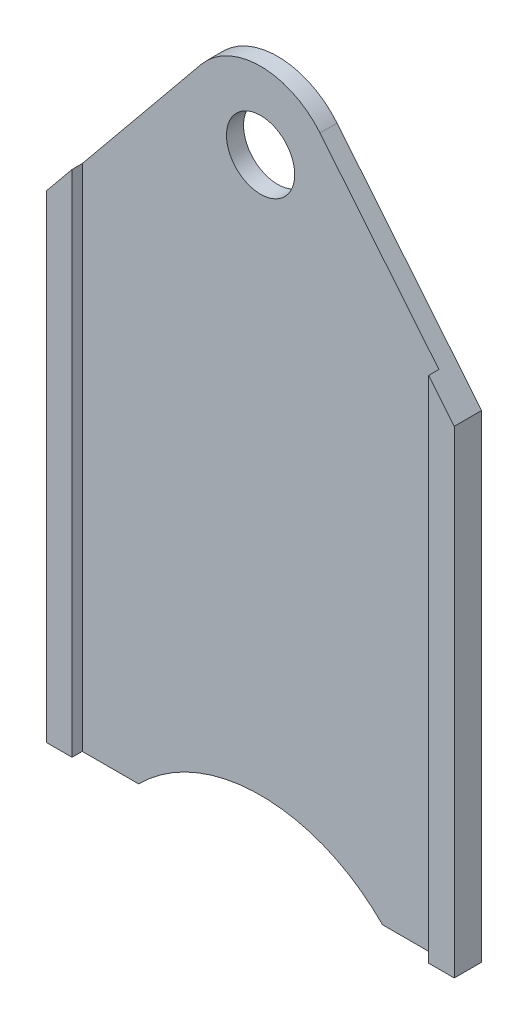
ISO-10303-21;
HEADER;
FILE_DESCRIPTION(('STEP AP214'),'2;1');
FILE_NAME('part.step','',(''),(''),'','','');
FILE_SCHEMA(('AUTOMOTIVE_DESIGN { 1 0 10303 214 1 1 1 1 }'));
ENDSEC;
DATA;
#1=APPLICATION_CONTEXT('core data for automotive mechanical design processes');
#2=APPLICATION_PROTOCOL_DEFINITION('international standard','automotive_design',2000,#1);
#3=PRODUCT_CONTEXT('',#1,'mechanical');
#4=PRODUCT('Part','Part','',(#3));
#5=PRODUCT_RELATED_PRODUCT_CATEGORY('part','',(#4));
#6=PRODUCT_DEFINITION_FORMATION('','',#4);
#7=PRODUCT_DEFINITION_CONTEXT('part definition',#1,'design');
#8=PRODUCT_DEFINITION('design','',#6,#7);
#9=PRODUCT_DEFINITION_SHAPE('','',#8);
#10=(LENGTH_UNIT() NAMED_UNIT(*) SI_UNIT(.MILLI.,.METRE.));
#11=(NAMED_UNIT(*) PLANE_ANGLE_UNIT() SI_UNIT($,.RADIAN.));
#12=(NAMED_UNIT(*) SI_UNIT($,.STERADIAN.) SOLID_ANGLE_UNIT());
#13=UNCERTAINTY_MEASURE_WITH_UNIT(LENGTH_MEASURE(1.E-05),#10,'distance_accuracy_value','');
#14=(GEOMETRIC_REPRESENTATION_CONTEXT(3) GLOBAL_UNCERTAINTY_ASSIGNED_CONTEXT((#13)) GLOBAL_UNIT_ASSIGNED_CONTEXT((#10,
#11,#12)) REPRESENTATION_CONTEXT('',''));
#15=CARTESIAN_POINT('',(0.,0.,0.));
#16=DIRECTION('',(0.,0.,1.));
#17=DIRECTION('',(1.,0.,0.));
#18=AXIS2_PLACEMENT_3D('',#15,#16,#17);
#19=CARTESIAN_POINT('',(0.,85.,2.));
#20=DIRECTION('',(0.,0.,1.));
#21=DIRECTION('',(1.,0.,0.));
#22=AXIS2_PLACEMENT_3D('',#19,#20,#21);
#23=PLANE('',#22);
#24=CARTESIAN_POINT('',(0.,85.,2.));
#25=DIRECTION('',(0.,0.,1.));
#26=DIRECTION('',(1.,0.,0.));
#27=AXIS2_PLACEMENT_3D('',#24,#25,#26);
#28=CIRCLE('',#27,4.00000000000001);
#29=CARTESIAN_POINT('',(4.00000000000001,85.,2.));
#30=VERTEX_POINT('',#29);
#31=EDGE_CURVE('E169',#30,#30,#28,.T.);
#32=ORIENTED_EDGE('',*,*,#31,.F.);
#33=EDGE_LOOP('',(#32));
#34=FACE_BOUND('',#33,.T.);
#35=DIRECTION('',(1.,0.,0.));
#36=VECTOR('',#35,1.);
#37=CARTESIAN_POINT('',(14.2828568570857,14.,2.));
#38=LINE('',#37,#36);
#39=CARTESIAN_POINT('',(14.2828568570857,14.,2.));
#40=VERTEX_POINT('',#39);
#41=CARTESIAN_POINT('',(20.9,14.,2.));
#42=VERTEX_POINT('',#41);
#43=EDGE_CURVE('E48',#40,#42,#38,.T.);
#44=ORIENTED_EDGE('',*,*,#43,.T.);
#45=DIRECTION('',(0.,-1.,0.));
#46=VECTOR('',#45,1.);
#47=CARTESIAN_POINT('',(20.9,14.,2.));
#48=LINE('',#47,#46);
#49=CARTESIAN_POINT('',(20.9,73.666942903836,2.));
#50=VERTEX_POINT('',#49);
#51=EDGE_CURVE('E142',#50,#42,#48,.T.);
#52=ORIENTED_EDGE('',*,*,#51,.F.);
#53=DIRECTION('',(-0.633209214452428,0.773980678526628,0.));
#54=VECTOR('',#53,1.);
#55=CARTESIAN_POINT('',(6.96582610673965,90.6988829300718,2.));
#56=LINE('',#55,#54);
#57=CARTESIAN_POINT('',(6.96582610673965,90.6988829300718,2.));
#58=VERTEX_POINT('',#57);
#59=EDGE_CURVE('E146',#50,#58,#56,.T.);
#60=ORIENTED_EDGE('',*,*,#59,.T.);
#61=CARTESIAN_POINT('',(0.,85.,2.));
#62=DIRECTION('',(0.,0.,1.));
#63=DIRECTION('',(1.,0.,0.));
#64=AXIS2_PLACEMENT_3D('',#61,#62,#63);
#65=CIRCLE('',#64,8.99999999999999);
#66=CARTESIAN_POINT('',(-6.96582610673965,90.6988829300718,2.));
#67=VERTEX_POINT('',#66);
#68=EDGE_CURVE('E182',#58,#67,#65,.T.);
#69=ORIENTED_EDGE('',*,*,#68,.T.);
#70=DIRECTION('',(-0.633209214452428,-0.773980678526628,0.));
#71=VECTOR('',#70,1.);
#72=CARTESIAN_POINT('',(-6.96582610673965,90.6988829300718,2.));
#73=LINE('',#72,#71);
#74=CARTESIAN_POINT('',(-20.9,73.666942903836,2.));
#75=VERTEX_POINT('',#74);
#76=EDGE_CURVE('E184',#67,#75,#73,.T.);
#77=ORIENTED_EDGE('',*,*,#76,.T.);
#78=DIRECTION('',(0.,1.,0.));
#79=VECTOR('',#78,1.);
#80=CARTESIAN_POINT('',(-20.9,14.,2.));
#81=LINE('',#80,#79);
#82=CARTESIAN_POINT('',(-20.9,14.,2.));
#83=VERTEX_POINT('',#82);
#84=EDGE_CURVE('E55',#83,#75,#81,.T.);
#85=ORIENTED_EDGE('',*,*,#84,.F.);
#86=DIRECTION('',(1.,0.,0.));
#87=VECTOR('',#86,1.);
#88=CARTESIAN_POINT('',(-23.9,14.,2.));
#89=LINE('',#88,#87);
#90=CARTESIAN_POINT('',(-14.2828568570857,14.,2.));
#91=VERTEX_POINT('',#90);
#92=EDGE_CURVE('E175',#83,#91,#89,.T.);
#93=ORIENTED_EDGE('',*,*,#92,.T.);
#94=CARTESIAN_POINT('',(0.,0.,2.));
#95=DIRECTION('',(0.,0.,-1.));
#96=DIRECTION('',(1.,0.,0.));
#97=AXIS2_PLACEMENT_3D('',#94,#95,#96);
#98=CIRCLE('',#97,20.);
#99=EDGE_CURVE('E177',#91,#40,#98,.T.);
#100=ORIENTED_EDGE('',*,*,#99,.T.);
#101=EDGE_LOOP('',(#44,#52,#60,#69,#77,#85,#93,#100));
#102=FACE_BOUND('',#101,.T.);
#103=ADVANCED_FACE('F33',(#34,#102),#23,.T.);
#104=CARTESIAN_POINT('',(0.,85.,0.));
#105=DIRECTION('',(0.,0.,1.));
#106=DIRECTION('',(1.,0.,0.));
#107=AXIS2_PLACEMENT_3D('',#104,#105,#106);
#108=PLANE('',#107);
#109=DIRECTION('',(0.,-1.,0.));
#110=VECTOR('',#109,1.);
#111=CARTESIAN_POINT('',(-23.9,14.,0.));
#112=LINE('',#111,#110);
#113=CARTESIAN_POINT('',(-23.9,70.,0.));
#114=VERTEX_POINT('',#113);
#115=CARTESIAN_POINT('',(-23.9,14.,0.));
#116=VERTEX_POINT('',#115);
#117=EDGE_CURVE('E172',#114,#116,#112,.T.);
#118=ORIENTED_EDGE('',*,*,#117,.F.);
#119=DIRECTION('',(-0.633209214452428,-0.773980678526628,0.));
#120=VECTOR('',#119,1.);
#121=CARTESIAN_POINT('',(-6.96582610673965,90.6988829300718,0.));
#122=LINE('',#121,#120);
#123=CARTESIAN_POINT('',(-6.96582610673965,90.6988829300718,0.));
#124=VERTEX_POINT('',#123);
#125=EDGE_CURVE('E178',#124,#114,#122,.T.);
#126=ORIENTED_EDGE('',*,*,#125,.F.);
#127=CARTESIAN_POINT('',(0.,85.,0.));
#128=DIRECTION('',(0.,0.,1.));
#129=DIRECTION('',(1.,0.,0.));
#130=AXIS2_PLACEMENT_3D('',#127,#128,#129);
#131=CIRCLE('',#130,8.99999999999999);
#132=CARTESIAN_POINT('',(6.96582610673965,90.6988829300718,0.));
#133=VERTEX_POINT('',#132);
#134=EDGE_CURVE('E199',#133,#124,#131,.T.);
#135=ORIENTED_EDGE('',*,*,#134,.F.);
#136=DIRECTION('',(-0.633209214452428,0.773980678526628,0.));
#137=VECTOR('',#136,1.);
#138=CARTESIAN_POINT('',(6.96582610673965,90.6988829300718,0.));
#139=LINE('',#138,#137);
#140=CARTESIAN_POINT('',(23.9,70.,0.));
#141=VERTEX_POINT('',#140);
#142=EDGE_CURVE('E197',#141,#133,#139,.T.);
#143=ORIENTED_EDGE('',*,*,#142,.F.);
#144=DIRECTION('',(0.,1.,0.));
#145=VECTOR('',#144,1.);
#146=CARTESIAN_POINT('',(23.9,14.,0.));
#147=LINE('',#146,#145);
#148=CARTESIAN_POINT('',(23.9,14.,0.));
#149=VERTEX_POINT('',#148);
#150=EDGE_CURVE('E195',#149,#141,#147,.T.);
#151=ORIENTED_EDGE('',*,*,#150,.F.);
#152=DIRECTION('',(1.,0.,0.));
#153=VECTOR('',#152,1.);
#154=CARTESIAN_POINT('',(14.2828568570857,14.,0.));
#155=LINE('',#154,#153);
#156=CARTESIAN_POINT('',(14.2828568570857,14.,0.));
#157=VERTEX_POINT('',#156);
#158=EDGE_CURVE('E193',#157,#149,#155,.T.);
#159=ORIENTED_EDGE('',*,*,#158,.F.);
#160=CARTESIAN_POINT('',(0.,0.,0.));
#161=DIRECTION('',(0.,0.,-1.));
#162=DIRECTION('',(1.,0.,0.));
#163=AXIS2_PLACEMENT_3D('',#160,#161,#162);
#164=CIRCLE('',#163,20.);
#165=CARTESIAN_POINT('',(-14.2828568570857,14.,0.));
#166=VERTEX_POINT('',#165);
#167=EDGE_CURVE('E191',#166,#157,#164,.T.);
#168=ORIENTED_EDGE('',*,*,#167,.F.);
#169=DIRECTION('',(1.,0.,0.));
#170=VECTOR('',#169,1.);
#171=CARTESIAN_POINT('',(-23.9,14.,0.));
#172=LINE('',#171,#170);
#173=EDGE_CURVE('E189',#116,#166,#172,.T.);
#174=ORIENTED_EDGE('',*,*,#173,.F.);
#175=EDGE_LOOP('',(#118,#126,#135,#143,#151,#159,#168,#174));
#176=FACE_BOUND('',#175,.T.);
#177=CARTESIAN_POINT('',(0.,85.,0.));
#178=DIRECTION('',(0.,0.,1.));
#179=DIRECTION('',(1.,0.,0.));
#180=AXIS2_PLACEMENT_3D('',#177,#178,#179);
#181=CIRCLE('',#180,4.00000000000001);
#182=CARTESIAN_POINT('',(4.00000000000001,85.,0.));
#183=VERTEX_POINT('',#182);
#184=EDGE_CURVE('E168',#183,#183,#181,.T.);
#185=ORIENTED_EDGE('',*,*,#184,.T.);
#186=EDGE_LOOP('',(#185));
#187=FACE_BOUND('',#186,.T.);
#188=ADVANCED_FACE('F228',(#176,#187),#108,.F.);
#189=CARTESIAN_POINT('',(-23.9,14.,2.));
#190=DIRECTION('',(1.,0.,0.));
#191=DIRECTION('',(0.,0.,-1.));
#192=AXIS2_PLACEMENT_3D('',#189,#190,#191);
#193=PLANE('',#192);
#194=ORIENTED_EDGE('',*,*,#117,.T.);
#195=DIRECTION('',(0.,0.,-1.));
#196=VECTOR('',#195,1.);
#197=CARTESIAN_POINT('',(-23.9,14.,2.));
#198=LINE('',#197,#196);
#199=CARTESIAN_POINT('',(-23.9,14.,3.2));
#200=VERTEX_POINT('',#199);
#201=EDGE_CURVE('E11',#200,#116,#198,.T.);
#202=ORIENTED_EDGE('',*,*,#201,.F.);
#203=DIRECTION('',(0.,-1.,0.));
#204=VECTOR('',#203,1.);
#205=CARTESIAN_POINT('',(-23.9,14.,3.2));
#206=LINE('',#205,#204);
#207=CARTESIAN_POINT('',(-23.9,70.,3.2));
#208=VERTEX_POINT('',#207);
#209=EDGE_CURVE('E148',#208,#200,#206,.T.);
#210=ORIENTED_EDGE('',*,*,#209,.F.);
#211=DIRECTION('',(0.,0.,-1.));
#212=VECTOR('',#211,1.);
#213=CARTESIAN_POINT('',(-23.9,70.,2.));
#214=LINE('',#213,#212);
#215=EDGE_CURVE('E186',#208,#114,#214,.T.);
#216=ORIENTED_EDGE('',*,*,#215,.T.);
#217=EDGE_LOOP('',(#194,#202,#210,#216));
#218=FACE_BOUND('',#217,.T.);
#219=ADVANCED_FACE('F35',(#218),#193,.F.);
#220=CARTESIAN_POINT('',(-23.9,14.,2.));
#221=DIRECTION('',(0.,1.,0.));
#222=DIRECTION('',(0.,0.,1.));
#223=AXIS2_PLACEMENT_3D('',#220,#221,#222);
#224=PLANE('',#223);
#225=ORIENTED_EDGE('',*,*,#173,.T.);
#226=DIRECTION('',(0.,0.,-1.));
#227=VECTOR('',#226,1.);
#228=CARTESIAN_POINT('',(-14.2828568570857,14.,2.));
#229=LINE('',#228,#227);
#230=EDGE_CURVE('E41',#91,#166,#229,.T.);
#231=ORIENTED_EDGE('',*,*,#230,.F.);
#232=ORIENTED_EDGE('',*,*,#92,.F.);
#233=DIRECTION('',(0.,0.,-1.));
#234=VECTOR('',#233,1.);
#235=CARTESIAN_POINT('',(-20.9,14.,3.2));
#236=LINE('',#235,#234);
#237=CARTESIAN_POINT('',(-20.9,14.,3.2));
#238=VERTEX_POINT('',#237);
#239=EDGE_CURVE('E165',#238,#83,#236,.T.);
#240=ORIENTED_EDGE('',*,*,#239,.F.);
#241=DIRECTION('',(1.,0.,0.));
#242=VECTOR('',#241,1.);
#243=CARTESIAN_POINT('',(-23.9,14.,3.2));
#244=LINE('',#243,#242);
#245=EDGE_CURVE('E155',#200,#238,#244,.T.);
#246=ORIENTED_EDGE('',*,*,#245,.F.);
#247=ORIENTED_EDGE('',*,*,#201,.T.);
#248=EDGE_LOOP('',(#225,#231,#232,#240,#246,#247));
#249=FACE_BOUND('',#248,.T.);
#250=ADVANCED_FACE('F254',(#249),#224,.F.);
#251=CARTESIAN_POINT('',(0.,0.,2.));
#252=DIRECTION('',(0.,0.,-1.));
#253=DIRECTION('',(-1.,0.,0.));
#254=AXIS2_PLACEMENT_3D('',#251,#252,#253);
#255=CYLINDRICAL_SURFACE('',#254,20.);
#256=ORIENTED_EDGE('',*,*,#167,.T.);
#257=DIRECTION('',(0.,0.,-1.));
#258=VECTOR('',#257,1.);
#259=CARTESIAN_POINT('',(14.2828568570857,14.,2.));
#260=LINE('',#259,#258);
#261=EDGE_CURVE('E215',#40,#157,#260,.T.);
#262=ORIENTED_EDGE('',*,*,#261,.F.);
#263=ORIENTED_EDGE('',*,*,#99,.F.);
#264=ORIENTED_EDGE('',*,*,#230,.T.);
#265=EDGE_LOOP('',(#256,#262,#263,#264));
#266=FACE_BOUND('',#265,.T.);
#267=ADVANCED_FACE('F222',(#266),#255,.F.);
#268=CARTESIAN_POINT('',(14.2828568570857,14.,2.));
#269=DIRECTION('',(0.,1.,0.));
#270=DIRECTION('',(0.,0.,1.));
#271=AXIS2_PLACEMENT_3D('',#268,#269,#270);
#272=PLANE('',#271);
#273=ORIENTED_EDGE('',*,*,#158,.T.);
#274=DIRECTION('',(0.,0.,-1.));
#275=VECTOR('',#274,1.);
#276=CARTESIAN_POINT('',(23.9,14.,2.));
#277=LINE('',#276,#275);
#278=CARTESIAN_POINT('',(23.9,14.,3.2));
#279=VERTEX_POINT('',#278);
#280=EDGE_CURVE('E212',#279,#149,#277,.T.);
#281=ORIENTED_EDGE('',*,*,#280,.F.);
#282=DIRECTION('',(1.,0.,0.));
#283=VECTOR('',#282,1.);
#284=CARTESIAN_POINT('',(23.9,14.,3.2));
#285=LINE('',#284,#283);
#286=CARTESIAN_POINT('',(20.9,14.,3.2));
#287=VERTEX_POINT('',#286);
#288=EDGE_CURVE('E132',#287,#279,#285,.T.);
#289=ORIENTED_EDGE('',*,*,#288,.F.);
#290=DIRECTION('',(0.,0.,-1.));
#291=VECTOR('',#290,1.);
#292=CARTESIAN_POINT('',(20.9,14.,3.2));
#293=LINE('',#292,#291);
#294=EDGE_CURVE('E128',#287,#42,#293,.T.);
#295=ORIENTED_EDGE('',*,*,#294,.T.);
#296=ORIENTED_EDGE('',*,*,#43,.F.);
#297=ORIENTED_EDGE('',*,*,#261,.T.);
#298=EDGE_LOOP('',(#273,#281,#289,#295,#296,#297));
#299=FACE_BOUND('',#298,.T.);
#300=ADVANCED_FACE('F233',(#299),#272,.F.);
#301=CARTESIAN_POINT('',(23.9,14.,2.));
#302=DIRECTION('',(-1.,0.,0.));
#303=DIRECTION('',(0.,0.,1.));
#304=AXIS2_PLACEMENT_3D('',#301,#302,#303);
#305=PLANE('',#304);
#306=ORIENTED_EDGE('',*,*,#150,.T.);
#307=DIRECTION('',(0.,0.,-1.));
#308=VECTOR('',#307,1.);
#309=CARTESIAN_POINT('',(23.9,70.,2.));
#310=LINE('',#309,#308);
#311=CARTESIAN_POINT('',(23.9,70.,3.2));
#312=VERTEX_POINT('',#311);
#313=EDGE_CURVE('E210',#312,#141,#310,.T.);
#314=ORIENTED_EDGE('',*,*,#313,.F.);
#315=DIRECTION('',(0.,1.,0.));
#316=VECTOR('',#315,1.);
#317=CARTESIAN_POINT('',(23.9,14.,3.2));
#318=LINE('',#317,#316);
#319=EDGE_CURVE('E139',#279,#312,#318,.T.);
#320=ORIENTED_EDGE('',*,*,#319,.F.);
#321=ORIENTED_EDGE('',*,*,#280,.T.);
#322=EDGE_LOOP('',(#306,#314,#320,#321));
#323=FACE_BOUND('',#322,.T.);
#324=ADVANCED_FACE('F235',(#323),#305,.F.);
#325=CARTESIAN_POINT('',(6.96582610673965,90.6988829300718,2.));
#326=DIRECTION('',(-0.773980678526628,-0.633209214452428,0.));
#327=DIRECTION('',(0.633209214452428,-0.773980678526628,0.));
#328=AXIS2_PLACEMENT_3D('',#325,#326,#327);
#329=PLANE('',#328);
#330=ORIENTED_EDGE('',*,*,#142,.T.);
#331=DIRECTION('',(0.,0.,-1.));
#332=VECTOR('',#331,1.);
#333=CARTESIAN_POINT('',(6.96582610673965,90.6988829300718,2.));
#334=LINE('',#333,#332);
#335=EDGE_CURVE('E207',#58,#133,#334,.T.);
#336=ORIENTED_EDGE('',*,*,#335,.F.);
#337=ORIENTED_EDGE('',*,*,#59,.F.);
#338=DIRECTION('',(0.,0.,-1.));
#339=VECTOR('',#338,1.);
#340=CARTESIAN_POINT('',(20.9,73.666942903836,3.2));
#341=LINE('',#340,#339);
#342=CARTESIAN_POINT('',(20.9,73.666942903836,3.2));
#343=VERTEX_POINT('',#342);
#344=EDGE_CURVE('E126',#343,#50,#341,.T.);
#345=ORIENTED_EDGE('',*,*,#344,.F.);
#346=DIRECTION('',(-0.633209214452427,0.773980678526629,0.));
#347=VECTOR('',#346,1.);
#348=CARTESIAN_POINT('',(23.9,70.,3.2));
#349=LINE('',#348,#347);
#350=EDGE_CURVE('E133',#312,#343,#349,.T.);
#351=ORIENTED_EDGE('',*,*,#350,.F.);
#352=ORIENTED_EDGE('',*,*,#313,.T.);
#353=EDGE_LOOP('',(#330,#336,#337,#345,#351,#352));
#354=FACE_BOUND('',#353,.T.);
#355=ADVANCED_FACE('F144',(#354),#329,.F.);
#356=CARTESIAN_POINT('',(0.,85.,2.));
#357=DIRECTION('',(0.,0.,-1.));
#358=DIRECTION('',(-1.,0.,0.));
#359=AXIS2_PLACEMENT_3D('',#356,#357,#358);
#360=CYLINDRICAL_SURFACE('',#359,8.99999999999999);
#361=ORIENTED_EDGE('',*,*,#134,.T.);
#362=DIRECTION('',(0.,0.,-1.));
#363=VECTOR('',#362,1.);
#364=CARTESIAN_POINT('',(-6.96582610673965,90.6988829300718,2.));
#365=LINE('',#364,#363);
#366=EDGE_CURVE('E204',#67,#124,#365,.T.);
#367=ORIENTED_EDGE('',*,*,#366,.F.);
#368=ORIENTED_EDGE('',*,*,#68,.F.);
#369=ORIENTED_EDGE('',*,*,#335,.T.);
#370=EDGE_LOOP('',(#361,#367,#368,#369));
#371=FACE_BOUND('',#370,.T.);
#372=ADVANCED_FACE('F242',(#371),#360,.T.);
#373=CARTESIAN_POINT('',(-6.96582610673965,90.6988829300718,2.));
#374=DIRECTION('',(0.773980678526628,-0.633209214452428,0.));
#375=DIRECTION('',(0.633209214452428,0.773980678526628,0.));
#376=AXIS2_PLACEMENT_3D('',#373,#374,#375);
#377=PLANE('',#376);
#378=ORIENTED_EDGE('',*,*,#125,.T.);
#379=ORIENTED_EDGE('',*,*,#215,.F.);
#380=DIRECTION('',(-0.633209214452427,-0.773980678526629,0.));
#381=VECTOR('',#380,1.);
#382=CARTESIAN_POINT('',(-20.9,73.666942903836,3.2));
#383=LINE('',#382,#381);
#384=CARTESIAN_POINT('',(-20.9,73.666942903836,3.2));
#385=VERTEX_POINT('',#384);
#386=EDGE_CURVE('E159',#385,#208,#383,.T.);
#387=ORIENTED_EDGE('',*,*,#386,.F.);
#388=DIRECTION('',(0.,0.,-1.));
#389=VECTOR('',#388,1.);
#390=CARTESIAN_POINT('',(-20.9,73.666942903836,3.2));
#391=LINE('',#390,#389);
#392=EDGE_CURVE('E161',#385,#75,#391,.T.);
#393=ORIENTED_EDGE('',*,*,#392,.T.);
#394=ORIENTED_EDGE('',*,*,#76,.F.);
#395=ORIENTED_EDGE('',*,*,#366,.T.);
#396=EDGE_LOOP('',(#378,#379,#387,#393,#394,#395));
#397=FACE_BOUND('',#396,.T.);
#398=ADVANCED_FACE('F246',(#397),#377,.F.);
#399=CARTESIAN_POINT('',(0.,85.,2.));
#400=DIRECTION('',(0.,0.,-1.));
#401=DIRECTION('',(-1.,0.,0.));
#402=AXIS2_PLACEMENT_3D('',#399,#400,#401);
#403=CYLINDRICAL_SURFACE('',#402,4.00000000000001);
#404=ORIENTED_EDGE('',*,*,#31,.T.);
#405=EDGE_LOOP('',(#404));
#406=FACE_BOUND('',#405,.T.);
#407=ORIENTED_EDGE('',*,*,#184,.F.);
#408=EDGE_LOOP('',(#407));
#409=FACE_BOUND('',#408,.T.);
#410=ADVANCED_FACE('F272',(#406,#409),#403,.F.);
#411=CARTESIAN_POINT('',(-20.9,14.,3.2));
#412=DIRECTION('',(-1.,0.,0.));
#413=DIRECTION('',(0.,0.,1.));
#414=AXIS2_PLACEMENT_3D('',#411,#412,#413);
#415=PLANE('',#414);
#416=ORIENTED_EDGE('',*,*,#84,.T.);
#417=ORIENTED_EDGE('',*,*,#392,.F.);
#418=DIRECTION('',(0.,1.,0.));
#419=VECTOR('',#418,1.);
#420=CARTESIAN_POINT('',(-20.9,14.,3.2));
#421=LINE('',#420,#419);
#422=EDGE_CURVE('E157',#238,#385,#421,.T.);
#423=ORIENTED_EDGE('',*,*,#422,.F.);
#424=ORIENTED_EDGE('',*,*,#239,.T.);
#425=EDGE_LOOP('',(#416,#417,#423,#424));
#426=FACE_BOUND('',#425,.T.);
#427=ADVANCED_FACE('F250',(#426),#415,.F.);
#428=CARTESIAN_POINT('',(0.,0.,3.2));
#429=DIRECTION('',(0.,0.,-1.));
#430=DIRECTION('',(-1.,0.,0.));
#431=AXIS2_PLACEMENT_3D('',#428,#429,#430);
#432=PLANE('',#431);
#433=ORIENTED_EDGE('',*,*,#209,.T.);
#434=ORIENTED_EDGE('',*,*,#245,.T.);
#435=ORIENTED_EDGE('',*,*,#422,.T.);
#436=ORIENTED_EDGE('',*,*,#386,.T.);
#437=EDGE_LOOP('',(#433,#434,#435,#436));
#438=FACE_BOUND('',#437,.T.);
#439=ADVANCED_FACE('F257',(#438),#432,.F.);
#440=CARTESIAN_POINT('',(20.9,14.,3.2));
#441=DIRECTION('',(1.,0.,0.));
#442=DIRECTION('',(0.,0.,-1.));
#443=AXIS2_PLACEMENT_3D('',#440,#441,#442);
#444=PLANE('',#443);
#445=ORIENTED_EDGE('',*,*,#51,.T.);
#446=ORIENTED_EDGE('',*,*,#294,.F.);
#447=DIRECTION('',(0.,-1.,0.));
#448=VECTOR('',#447,1.);
#449=CARTESIAN_POINT('',(20.9,14.,3.2));
#450=LINE('',#449,#448);
#451=EDGE_CURVE('E122',#343,#287,#450,.T.);
#452=ORIENTED_EDGE('',*,*,#451,.F.);
#453=ORIENTED_EDGE('',*,*,#344,.T.);
#454=EDGE_LOOP('',(#445,#446,#452,#453));
#455=FACE_BOUND('',#454,.T.);
#456=ADVANCED_FACE('F124',(#455),#444,.F.);
#457=CARTESIAN_POINT('',(0.,0.,3.2));
#458=DIRECTION('',(0.,0.,1.));
#459=DIRECTION('',(1.,0.,0.));
#460=AXIS2_PLACEMENT_3D('',#457,#458,#459);
#461=PLANE('',#460);
#462=ORIENTED_EDGE('',*,*,#350,.T.);
#463=ORIENTED_EDGE('',*,*,#451,.T.);
#464=ORIENTED_EDGE('',*,*,#288,.T.);
#465=ORIENTED_EDGE('',*,*,#319,.T.);
#466=EDGE_LOOP('',(#462,#463,#464,#465));
#467=FACE_BOUND('',#466,.T.);
#468=ADVANCED_FACE('F137',(#467),#461,.T.);
#469=CLOSED_SHELL('',(#103,#188,#219,#250,#267,#300,#324,#355,#372,#398,#410,#427,#439,#456,#468));
#470=MANIFOLD_SOLID_BREP('B2',#469);
#471=ADVANCED_BREP_SHAPE_REPRESENTATION('',(#18,#470),#14);
#472=SHAPE_DEFINITION_REPRESENTATION(#9,#471);
ENDSEC;
END-ISO-10303-21;
